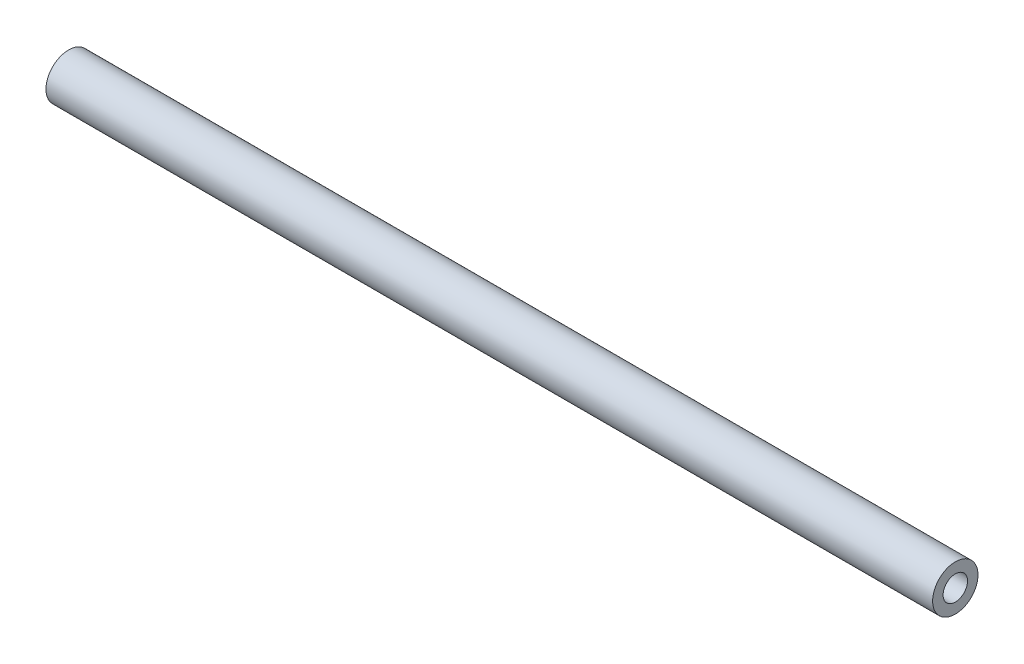
ISO-10303-21;
HEADER;
FILE_DESCRIPTION(('STEP AP214'),'2;1');
FILE_NAME('part.step','',(''),(''),'','','');
FILE_SCHEMA(('AUTOMOTIVE_DESIGN { 1 0 10303 214 1 1 1 1 }'));
ENDSEC;
DATA;
#1=APPLICATION_CONTEXT('core data for automotive mechanical design processes');
#2=APPLICATION_PROTOCOL_DEFINITION('international standard','automotive_design',2000,#1);
#3=PRODUCT_CONTEXT('',#1,'mechanical');
#4=PRODUCT('Part','Part','',(#3));
#5=PRODUCT_RELATED_PRODUCT_CATEGORY('part','',(#4));
#6=PRODUCT_DEFINITION_FORMATION('','',#4);
#7=PRODUCT_DEFINITION_CONTEXT('part definition',#1,'design');
#8=PRODUCT_DEFINITION('design','',#6,#7);
#9=PRODUCT_DEFINITION_SHAPE('','',#8);
#10=(LENGTH_UNIT() NAMED_UNIT(*) SI_UNIT(.MILLI.,.METRE.));
#11=(NAMED_UNIT(*) PLANE_ANGLE_UNIT() SI_UNIT($,.RADIAN.));
#12=(NAMED_UNIT(*) SI_UNIT($,.STERADIAN.) SOLID_ANGLE_UNIT());
#13=UNCERTAINTY_MEASURE_WITH_UNIT(LENGTH_MEASURE(1.E-05),#10,'distance_accuracy_value','');
#14=(GEOMETRIC_REPRESENTATION_CONTEXT(3) GLOBAL_UNCERTAINTY_ASSIGNED_CONTEXT((#13)) GLOBAL_UNIT_ASSIGNED_CONTEXT((#10,
#11,#12)) REPRESENTATION_CONTEXT('',''));
#15=CARTESIAN_POINT('',(0.,0.,0.));
#16=DIRECTION('',(0.,0.,1.));
#17=DIRECTION('',(1.,0.,0.));
#18=AXIS2_PLACEMENT_3D('',#15,#16,#17);
#19=CARTESIAN_POINT('',(127.,0.,0.));
#20=DIRECTION('',(1.,0.,0.));
#21=DIRECTION('',(0.,0.,-1.));
#22=AXIS2_PLACEMENT_3D('',#19,#20,#21);
#23=PLANE('',#22);
#24=CARTESIAN_POINT('',(127.,0.,0.));
#25=DIRECTION('',(1.,0.,0.));
#26=DIRECTION('',(0.,0.,-1.));
#27=AXIS2_PLACEMENT_3D('',#24,#25,#26);
#28=CIRCLE('',#27,6.5);
#29=CARTESIAN_POINT('',(127.,0.,-6.5));
#30=VERTEX_POINT('',#29);
#31=EDGE_CURVE('E10',#30,#30,#28,.T.);
#32=ORIENTED_EDGE('',*,*,#31,.T.);
#33=EDGE_LOOP('',(#32));
#34=FACE_BOUND('',#33,.T.);
#35=CARTESIAN_POINT('',(127.,0.,0.));
#36=DIRECTION('',(1.,0.,0.));
#37=DIRECTION('',(0.,0.,-1.));
#38=AXIS2_PLACEMENT_3D('',#35,#36,#37);
#39=CIRCLE('',#38,3.5);
#40=CARTESIAN_POINT('',(127.,0.,-3.5));
#41=VERTEX_POINT('',#40);
#42=EDGE_CURVE('E42',#41,#41,#39,.T.);
#43=ORIENTED_EDGE('',*,*,#42,.F.);
#44=EDGE_LOOP('',(#43));
#45=FACE_BOUND('',#44,.T.);
#46=ADVANCED_FACE('F31',(#34,#45),#23,.T.);
#47=CARTESIAN_POINT('',(-127.,0.,0.));
#48=DIRECTION('',(1.,0.,0.));
#49=DIRECTION('',(0.,0.,-1.));
#50=AXIS2_PLACEMENT_3D('',#47,#48,#49);
#51=PLANE('',#50);
#52=CARTESIAN_POINT('',(-127.,0.,0.));
#53=DIRECTION('',(1.,0.,0.));
#54=DIRECTION('',(0.,0.,-1.));
#55=AXIS2_PLACEMENT_3D('',#52,#53,#54);
#56=CIRCLE('',#55,6.5);
#57=CARTESIAN_POINT('',(-127.,0.,-6.5));
#58=VERTEX_POINT('',#57);
#59=EDGE_CURVE('E35',#58,#58,#56,.T.);
#60=ORIENTED_EDGE('',*,*,#59,.F.);
#61=EDGE_LOOP('',(#60));
#62=FACE_BOUND('',#61,.T.);
#63=CARTESIAN_POINT('',(-127.,0.,0.));
#64=DIRECTION('',(1.,0.,0.));
#65=DIRECTION('',(0.,0.,-1.));
#66=AXIS2_PLACEMENT_3D('',#63,#64,#65);
#67=CIRCLE('',#66,3.5);
#68=CARTESIAN_POINT('',(-127.,0.,-3.5));
#69=VERTEX_POINT('',#68);
#70=EDGE_CURVE('E44',#69,#69,#67,.T.);
#71=ORIENTED_EDGE('',*,*,#70,.T.);
#72=EDGE_LOOP('',(#71));
#73=FACE_BOUND('',#72,.T.);
#74=ADVANCED_FACE('F54',(#62,#73),#51,.F.);
#75=CARTESIAN_POINT('',(127.,0.,0.));
#76=DIRECTION('',(-1.,0.,0.));
#77=DIRECTION('',(0.,0.,1.));
#78=AXIS2_PLACEMENT_3D('',#75,#76,#77);
#79=CYLINDRICAL_SURFACE('',#78,6.5);
#80=ORIENTED_EDGE('',*,*,#31,.F.);
#81=EDGE_LOOP('',(#80));
#82=FACE_BOUND('',#81,.T.);
#83=ORIENTED_EDGE('',*,*,#59,.T.);
#84=EDGE_LOOP('',(#83));
#85=FACE_BOUND('',#84,.T.);
#86=ADVANCED_FACE('F33',(#82,#85),#79,.T.);
#87=CARTESIAN_POINT('',(127.,0.,0.));
#88=DIRECTION('',(-1.,0.,0.));
#89=DIRECTION('',(0.,0.,1.));
#90=AXIS2_PLACEMENT_3D('',#87,#88,#89);
#91=CYLINDRICAL_SURFACE('',#90,3.5);
#92=ORIENTED_EDGE('',*,*,#42,.T.);
#93=EDGE_LOOP('',(#92));
#94=FACE_BOUND('',#93,.T.);
#95=ORIENTED_EDGE('',*,*,#70,.F.);
#96=EDGE_LOOP('',(#95));
#97=FACE_BOUND('',#96,.T.);
#98=ADVANCED_FACE('F50',(#94,#97),#91,.F.);
#99=CLOSED_SHELL('',(#46,#74,#86,#98));
#100=MANIFOLD_SOLID_BREP('B2',#99);
#101=ADVANCED_BREP_SHAPE_REPRESENTATION('',(#18,#100),#14);
#102=SHAPE_DEFINITION_REPRESENTATION(#9,#101);
ENDSEC;
END-ISO-10303-21;
